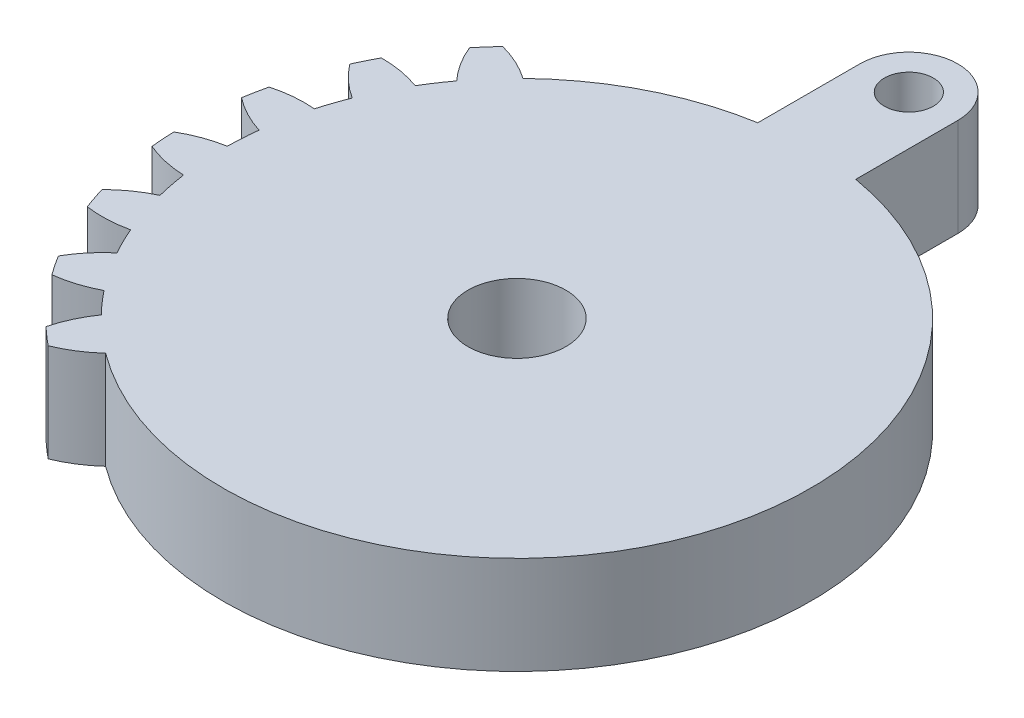
ISO-10303-21;
HEADER;
FILE_DESCRIPTION(('STEP AP214'),'2;1');
FILE_NAME('part.step','',(''),(''),'','','');
FILE_SCHEMA(('AUTOMOTIVE_DESIGN { 1 0 10303 214 1 1 1 1 }'));
ENDSEC;
DATA;
#1=APPLICATION_CONTEXT('core data for automotive mechanical design processes');
#2=APPLICATION_PROTOCOL_DEFINITION('international standard','automotive_design',2000,#1);
#3=PRODUCT_CONTEXT('',#1,'mechanical');
#4=PRODUCT('Part','Part','',(#3));
#5=PRODUCT_RELATED_PRODUCT_CATEGORY('part','',(#4));
#6=PRODUCT_DEFINITION_FORMATION('','',#4);
#7=PRODUCT_DEFINITION_CONTEXT('part definition',#1,'design');
#8=PRODUCT_DEFINITION('design','',#6,#7);
#9=PRODUCT_DEFINITION_SHAPE('','',#8);
#10=(LENGTH_UNIT() NAMED_UNIT(*) SI_UNIT(.MILLI.,.METRE.));
#11=(NAMED_UNIT(*) PLANE_ANGLE_UNIT() SI_UNIT($,.RADIAN.));
#12=(NAMED_UNIT(*) SI_UNIT($,.STERADIAN.) SOLID_ANGLE_UNIT());
#13=UNCERTAINTY_MEASURE_WITH_UNIT(LENGTH_MEASURE(1.E-05),#10,'distance_accuracy_value','');
#14=(GEOMETRIC_REPRESENTATION_CONTEXT(3) GLOBAL_UNCERTAINTY_ASSIGNED_CONTEXT((#13)) GLOBAL_UNIT_ASSIGNED_CONTEXT((#10,
#11,#12)) REPRESENTATION_CONTEXT('',''));
#15=CARTESIAN_POINT('',(0.,0.,0.));
#16=DIRECTION('',(0.,0.,1.));
#17=DIRECTION('',(1.,0.,0.));
#18=AXIS2_PLACEMENT_3D('',#15,#16,#17);
#19=CARTESIAN_POINT('',(0.,6.35,0.));
#20=DIRECTION('',(0.,-1.,0.));
#21=DIRECTION('',(0.,0.,-1.));
#22=AXIS2_PLACEMENT_3D('',#19,#20,#21);
#23=CYLINDRICAL_SURFACE('',#22,19.05);
#24=CARTESIAN_POINT('',(0.,6.35,0.));
#25=DIRECTION('',(0.,1.,0.));
#26=DIRECTION('',(0.,0.,1.));
#27=AXIS2_PLACEMENT_3D('',#24,#25,#26);
#28=CIRCLE('',#27,19.05);
#29=CARTESIAN_POINT('',(-3.175,6.35,-18.7835533113413));
#30=VERTEX_POINT('',#29);
#31=CARTESIAN_POINT('',(-13.2726773518231,6.35,-13.6652309133217));
#32=VERTEX_POINT('',#31);
#33=EDGE_CURVE('E55',#30,#32,#28,.T.);
#34=ORIENTED_EDGE('',*,*,#33,.F.);
#35=DIRECTION('',(0.,-1.,0.));
#36=VECTOR('',#35,1.);
#37=CARTESIAN_POINT('',(-3.175,6.35,-18.7835533113413));
#38=LINE('',#37,#36);
#39=CARTESIAN_POINT('',(-3.175,0.,-18.7835533113413));
#40=VERTEX_POINT('',#39);
#41=EDGE_CURVE('E273',#30,#40,#38,.T.);
#42=ORIENTED_EDGE('',*,*,#41,.T.);
#43=CARTESIAN_POINT('',(0.,0.,0.));
#44=DIRECTION('',(0.,1.,0.));
#45=DIRECTION('',(0.,0.,1.));
#46=AXIS2_PLACEMENT_3D('',#43,#44,#45);
#47=CIRCLE('',#46,19.05);
#48=CARTESIAN_POINT('',(-13.2726773518231,0.,-13.6652309133217));
#49=VERTEX_POINT('',#48);
#50=EDGE_CURVE('E606',#40,#49,#47,.T.);
#51=ORIENTED_EDGE('',*,*,#50,.T.);
#52=DIRECTION('',(0.,-1.,0.));
#53=VECTOR('',#52,1.);
#54=CARTESIAN_POINT('',(-13.2726773518231,11.211783242488,-13.6652309133217));
#55=LINE('',#54,#53);
#56=EDGE_CURVE('E324',#32,#49,#55,.T.);
#57=ORIENTED_EDGE('',*,*,#56,.F.);
#58=EDGE_LOOP('',(#34,#42,#51,#57));
#59=FACE_BOUND('',#58,.T.);
#60=ADVANCED_FACE('F44',(#59),#23,.T.);
#61=DIRECTION('',(0.,-1.,0.));
#62=VECTOR('',#61,1.);
#63=CARTESIAN_POINT('',(-15.2807550037981,11.211783242488,-11.375457200214));
#64=LINE('',#63,#62);
#65=CARTESIAN_POINT('',(-15.2807550037981,6.35,-11.375457200214));
#66=VERTEX_POINT('',#65);
#67=CARTESIAN_POINT('',(-15.2807550037981,0.,-11.375457200214));
#68=VERTEX_POINT('',#67);
#69=EDGE_CURVE('E332',#66,#68,#64,.T.);
#70=ORIENTED_EDGE('',*,*,#69,.T.);
#71=CARTESIAN_POINT('',(-16.3572438542193,0.,-9.76437778322842));
#72=VERTEX_POINT('',#71);
#73=EDGE_CURVE('E638',#68,#72,#47,.T.);
#74=ORIENTED_EDGE('',*,*,#73,.T.);
#75=DIRECTION('',(0.,-1.,0.));
#76=VECTOR('',#75,1.);
#77=CARTESIAN_POINT('',(-16.3572438542193,10.964723471058,-9.76437778322842));
#78=LINE('',#77,#76);
#79=CARTESIAN_POINT('',(-16.3572438542193,6.35,-9.76437778322842));
#80=VERTEX_POINT('',#79);
#81=EDGE_CURVE('E361',#80,#72,#78,.T.);
#82=ORIENTED_EDGE('',*,*,#81,.F.);
#83=EDGE_CURVE('E653',#66,#80,#28,.T.);
#84=ORIENTED_EDGE('',*,*,#83,.F.);
#85=EDGE_LOOP('',(#70,#74,#82,#84));
#86=FACE_BOUND('',#85,.T.);
#87=ADVANCED_FACE('F590',(#86),#23,.T.);
#88=DIRECTION('',(0.,-1.,0.));
#89=VECTOR('',#88,1.);
#90=CARTESIAN_POINT('',(-17.7042608735284,10.964723471058,-7.03289747700406));
#91=LINE('',#90,#89);
#92=CARTESIAN_POINT('',(-17.7042608735284,6.35,-7.03289747700406));
#93=VERTEX_POINT('',#92);
#94=CARTESIAN_POINT('',(-17.7042608735284,0.,-7.03289747700406));
#95=VERTEX_POINT('',#94);
#96=EDGE_CURVE('E369',#93,#95,#91,.T.);
#97=ORIENTED_EDGE('',*,*,#96,.T.);
#98=CARTESIAN_POINT('',(-18.327091219574,0.,-5.19809844360539));
#99=VERTEX_POINT('',#98);
#100=EDGE_CURVE('E565',#95,#99,#47,.T.);
#101=ORIENTED_EDGE('',*,*,#100,.T.);
#102=DIRECTION('',(0.,-1.,0.));
#103=VECTOR('',#102,1.);
#104=CARTESIAN_POINT('',(-18.327091219574,10.5928529083665,-5.1980984436054));
#105=LINE('',#104,#103);
#106=CARTESIAN_POINT('',(-18.327091219574,6.35,-5.19809844360539));
#107=VERTEX_POINT('',#106);
#108=EDGE_CURVE('E545',#107,#99,#105,.T.);
#109=ORIENTED_EDGE('',*,*,#108,.F.);
#110=EDGE_CURVE('E604',#93,#107,#28,.T.);
#111=ORIENTED_EDGE('',*,*,#110,.F.);
#112=EDGE_LOOP('',(#97,#101,#109,#111));
#113=FACE_BOUND('',#112,.T.);
#114=ADVANCED_FACE('F594',(#113),#23,.T.);
#115=CARTESIAN_POINT('',(-11.375457200214,0.,15.2807550037981));
#116=VERTEX_POINT('',#115);
#117=CARTESIAN_POINT('',(3.175,0.,-18.7835533113413));
#118=VERTEX_POINT('',#117);
#119=EDGE_CURVE('E639',#116,#118,#47,.T.);
#120=ORIENTED_EDGE('',*,*,#119,.T.);
#121=DIRECTION('',(0.,-1.,0.));
#122=VECTOR('',#121,1.);
#123=CARTESIAN_POINT('',(3.175,6.35,-18.7835533113413));
#124=LINE('',#123,#122);
#125=CARTESIAN_POINT('',(3.175,6.35,-18.7835533113413));
#126=VERTEX_POINT('',#125);
#127=EDGE_CURVE('E69',#118,#126,#124,.F.);
#128=ORIENTED_EDGE('',*,*,#127,.T.);
#129=CARTESIAN_POINT('',(-11.375457200214,6.35,15.2807550037981));
#130=VERTEX_POINT('',#129);
#131=EDGE_CURVE('E685',#130,#126,#28,.T.);
#132=ORIENTED_EDGE('',*,*,#131,.F.);
#133=DIRECTION('',(0.,-1.,0.));
#134=VECTOR('',#133,1.);
#135=CARTESIAN_POINT('',(-11.375457200214,11.211783242488,15.2807550037981));
#136=LINE('',#135,#134);
#137=EDGE_CURVE('E406',#130,#116,#136,.T.);
#138=ORIENTED_EDGE('',*,*,#137,.T.);
#139=EDGE_LOOP('',(#120,#128,#132,#138));
#140=FACE_BOUND('',#139,.T.);
#141=ADVANCED_FACE('F997',(#140),#23,.T.);
#142=CARTESIAN_POINT('',(-14.9427983140612,0.,11.8158909332005));
#143=VERTEX_POINT('',#142);
#144=CARTESIAN_POINT('',(-13.6652309133216,0.,13.2726773518232));
#145=VERTEX_POINT('',#144);
#146=EDGE_CURVE('E659',#143,#145,#47,.T.);
#147=ORIENTED_EDGE('',*,*,#146,.T.);
#148=DIRECTION('',(0.,-1.,0.));
#149=VECTOR('',#148,1.);
#150=CARTESIAN_POINT('',(-13.6652309133216,11.211783242488,13.2726773518232));
#151=LINE('',#150,#149);
#152=CARTESIAN_POINT('',(-13.6652309133216,6.35,13.2726773518232));
#153=VERTEX_POINT('',#152);
#154=EDGE_CURVE('E398',#153,#145,#151,.T.);
#155=ORIENTED_EDGE('',*,*,#154,.F.);
#156=CARTESIAN_POINT('',(-14.9427983140612,6.35,11.8158909332005));
#157=VERTEX_POINT('',#156);
#158=EDGE_CURVE('E682',#157,#153,#28,.T.);
#159=ORIENTED_EDGE('',*,*,#158,.F.);
#160=DIRECTION('',(0.,-1.,0.));
#161=VECTOR('',#160,1.);
#162=CARTESIAN_POINT('',(-14.9427983140612,11.1289223719387,11.8158909332005));
#163=LINE('',#162,#161);
#164=EDGE_CURVE('E443',#157,#143,#163,.T.);
#165=ORIENTED_EDGE('',*,*,#164,.T.);
#166=EDGE_LOOP('',(#147,#155,#159,#165));
#167=FACE_BOUND('',#166,.T.);
#168=ADVANCED_FACE('F1006',(#167),#23,.T.);
#169=CARTESIAN_POINT('',(-17.4918124169469,0.,7.54579342218832));
#170=VERTEX_POINT('',#169);
#171=CARTESIAN_POINT('',(-16.6348211395338,0.,9.28359982203663));
#172=VERTEX_POINT('',#171);
#173=EDGE_CURVE('E661',#170,#172,#47,.T.);
#174=ORIENTED_EDGE('',*,*,#173,.T.);
#175=DIRECTION('',(0.,-1.,0.));
#176=VECTOR('',#175,1.);
#177=CARTESIAN_POINT('',(-16.6348211395338,11.1289223719387,9.28359982203664));
#178=LINE('',#177,#176);
#179=CARTESIAN_POINT('',(-16.6348211395338,6.35,9.28359982203663));
#180=VERTEX_POINT('',#179);
#181=EDGE_CURVE('E435',#180,#172,#178,.T.);
#182=ORIENTED_EDGE('',*,*,#181,.F.);
#183=CARTESIAN_POINT('',(-17.4918124169469,6.35,7.54579342218833));
#184=VERTEX_POINT('',#183);
#185=EDGE_CURVE('E680',#184,#180,#28,.T.);
#186=ORIENTED_EDGE('',*,*,#185,.F.);
#187=DIRECTION('',(0.,-1.,0.));
#188=VECTOR('',#187,1.);
#189=CARTESIAN_POINT('',(-17.4918124169469,10.7707527895386,7.54579342218832));
#190=LINE('',#189,#188);
#191=EDGE_CURVE('E480',#184,#170,#190,.T.);
#192=ORIENTED_EDGE('',*,*,#191,.T.);
#193=EDGE_LOOP('',(#174,#182,#186,#192));
#194=FACE_BOUND('',#193,.T.);
#195=ADVANCED_FACE('F587',(#194),#23,.T.);
#196=CARTESIAN_POINT('',(-18.8487884102045,0.,2.76146255946726));
#197=VERTEX_POINT('',#196);
#198=CARTESIAN_POINT('',(-18.4707757954285,0.,4.6618603062524));
#199=VERTEX_POINT('',#198);
#200=EDGE_CURVE('E605',#197,#199,#47,.T.);
#201=ORIENTED_EDGE('',*,*,#200,.T.);
#202=DIRECTION('',(0.,-1.,0.));
#203=VECTOR('',#202,1.);
#204=CARTESIAN_POINT('',(-18.4707757954285,10.7707527895386,4.6618603062524));
#205=LINE('',#204,#203);
#206=CARTESIAN_POINT('',(-18.4707757954285,6.35,4.6618603062524));
#207=VERTEX_POINT('',#206);
#208=EDGE_CURVE('E472',#207,#199,#205,.T.);
#209=ORIENTED_EDGE('',*,*,#208,.F.);
#210=CARTESIAN_POINT('',(-18.8487884102045,6.35,2.76146255946724));
#211=VERTEX_POINT('',#210);
#212=EDGE_CURVE('E54',#211,#207,#28,.T.);
#213=ORIENTED_EDGE('',*,*,#212,.F.);
#214=DIRECTION('',(0.,-1.,0.));
#215=VECTOR('',#214,1.);
#216=CARTESIAN_POINT('',(-18.8487884102045,10.4361096651987,2.76146255946724));
#217=LINE('',#216,#215);
#218=EDGE_CURVE('E517',#211,#197,#217,.T.);
#219=ORIENTED_EDGE('',*,*,#218,.T.);
#220=EDGE_LOOP('',(#201,#209,#213,#219));
#221=FACE_BOUND('',#220,.T.);
#222=ADVANCED_FACE('F581',(#221),#23,.T.);
#223=CARTESIAN_POINT('',(0.,6.35,0.));
#224=DIRECTION('',(0.,1.,0.));
#225=DIRECTION('',(0.,0.,1.));
#226=AXIS2_PLACEMENT_3D('',#223,#224,#225);
#227=PLANE('',#226);
#228=CARTESIAN_POINT('',(0.,6.35,0.));
#229=DIRECTION('',(0.,1.,0.));
#230=DIRECTION('',(0.,0.,1.));
#231=AXIS2_PLACEMENT_3D('',#228,#229,#230);
#232=CIRCLE('',#231,3.175);
#233=CARTESIAN_POINT('',(0.,6.35,3.175));
#234=VERTEX_POINT('',#233);
#235=EDGE_CURVE('E561',#234,#234,#232,.T.);
#236=ORIENTED_EDGE('',*,*,#235,.F.);
#237=EDGE_LOOP('',(#236));
#238=FACE_BOUND('',#237,.T.);
#239=ORIENTED_EDGE('',*,*,#131,.T.);
#240=DIRECTION('',(0.,0.,-1.));
#241=VECTOR('',#240,1.);
#242=CARTESIAN_POINT('',(3.175,6.35,-25.3999999016287));
#243=LINE('',#242,#241);
#244=CARTESIAN_POINT('',(3.175,6.35,-25.3999999016287));
#245=VERTEX_POINT('',#244);
#246=EDGE_CURVE('E268',#126,#245,#243,.T.);
#247=ORIENTED_EDGE('',*,*,#246,.T.);
#248=CARTESIAN_POINT('',(0.,6.35,-25.4));
#249=DIRECTION('',(0.,1.,0.));
#250=DIRECTION('',(0.,0.,1.));
#251=AXIS2_PLACEMENT_3D('',#248,#249,#250);
#252=CIRCLE('',#251,3.175);
#253=CARTESIAN_POINT('',(-3.175,6.35,-25.3999999016287));
#254=VERTEX_POINT('',#253);
#255=EDGE_CURVE('E262',#245,#254,#252,.T.);
#256=ORIENTED_EDGE('',*,*,#255,.T.);
#257=DIRECTION('',(0.,0.,1.));
#258=VECTOR('',#257,1.);
#259=CARTESIAN_POINT('',(-3.175,6.35,-25.3999999016287));
#260=LINE('',#259,#258);
#261=EDGE_CURVE('E271',#254,#30,#260,.T.);
#262=ORIENTED_EDGE('',*,*,#261,.T.);
#263=ORIENTED_EDGE('',*,*,#33,.T.);
#264=CARTESIAN_POINT('',(-17.649504588583,6.35,-7.42762052635798));
#265=DIRECTION('',(0.,1.,0.));
#266=DIRECTION('',(0.,0.,1.));
#267=AXIS2_PLACEMENT_3D('',#264,#265,#266);
#268=CIRCLE('',#267,7.62);
#269=CARTESIAN_POINT('',(-15.7197681360626,6.35,-14.7992226062192));
#270=VERTEX_POINT('',#269);
#271=EDGE_CURVE('E308',#270,#32,#268,.F.);
#272=ORIENTED_EDGE('',*,*,#271,.F.);
#273=CARTESIAN_POINT('',(0.,6.35,0.));
#274=DIRECTION('',(0.,1.,0.));
#275=DIRECTION('',(0.,0.,1.));
#276=AXIS2_PLACEMENT_3D('',#273,#274,#275);
#277=CIRCLE('',#276,21.59);
#278=CARTESIAN_POINT('',(-16.7244546826455,6.35,-13.6535971658804));
#279=VERTEX_POINT('',#278);
#280=EDGE_CURVE('E303',#270,#279,#277,.T.);
#281=ORIENTED_EDGE('',*,*,#280,.T.);
#282=CARTESIAN_POINT('',(-9.66779883161027,6.35,-16.5290116055831));
#283=DIRECTION('',(0.,1.,0.));
#284=DIRECTION('',(0.,0.,1.));
#285=AXIS2_PLACEMENT_3D('',#282,#283,#284);
#286=CIRCLE('',#285,7.62);
#287=EDGE_CURVE('E309',#279,#66,#286,.T.);
#288=ORIENTED_EDGE('',*,*,#287,.T.);
#289=ORIENTED_EDGE('',*,*,#83,.T.);
#290=CARTESIAN_POINT('',(-18.9705219553356,6.35,-2.60650257013437));
#291=DIRECTION('',(0.,1.,0.));
#292=DIRECTION('',(0.,0.,1.));
#293=AXIS2_PLACEMENT_3D('',#290,#291,#292);
#294=CIRCLE('',#293,7.62);
#295=CARTESIAN_POINT('',(-19.0144506891002,6.35,-10.2263759461394));
#296=VERTEX_POINT('',#295);
#297=EDGE_CURVE('E345',#296,#80,#294,.F.);
#298=ORIENTED_EDGE('',*,*,#297,.F.);
#299=CARTESIAN_POINT('',(0.,6.35,0.));
#300=DIRECTION('',(0.,1.,0.));
#301=DIRECTION('',(0.,0.,1.));
#302=AXIS2_PLACEMENT_3D('',#299,#300,#301);
#303=CIRCLE('',#302,21.59);
#304=CARTESIAN_POINT('',(-19.6883936892561,6.35,-8.85975473344842));
#305=VERTEX_POINT('',#304);
#306=EDGE_CURVE('E320',#296,#305,#303,.T.);
#307=ORIENTED_EDGE('',*,*,#306,.T.);
#308=CARTESIAN_POINT('',(-13.6163995750651,6.35,-13.4635887310238));
#309=DIRECTION('',(0.,1.,0.));
#310=DIRECTION('',(0.,0.,1.));
#311=AXIS2_PLACEMENT_3D('',#308,#309,#310);
#312=CIRCLE('',#311,7.62);
#313=EDGE_CURVE('E346',#305,#93,#312,.T.);
#314=ORIENTED_EDGE('',*,*,#313,.T.);
#315=ORIENTED_EDGE('',*,*,#110,.T.);
#316=CARTESIAN_POINT('',(-18.9987296011018,6.35,2.39224422879474));
#317=DIRECTION('',(0.,1.,0.));
#318=DIRECTION('',(0.,0.,1.));
#319=AXIS2_PLACEMENT_3D('',#316,#317,#318);
#320=CIRCLE('',#319,7.62);
#321=CARTESIAN_POINT('',(-21.013329850541,6.35,-4.95661866521543));
#322=VERTEX_POINT('',#321);
#323=EDGE_CURVE('E529',#322,#107,#320,.F.);
#324=ORIENTED_EDGE('',*,*,#323,.F.);
#325=CARTESIAN_POINT('',(0.,6.35,0.));
#326=DIRECTION('',(0.,1.,0.));
#327=DIRECTION('',(0.,0.,1.));
#328=AXIS2_PLACEMENT_3D('',#325,#326,#327);
#329=CIRCLE('',#328,21.59);
#330=CARTESIAN_POINT('',(-21.3106012025528,6.35,-3.46213465736889));
#331=VERTEX_POINT('',#330);
#332=EDGE_CURVE('E505',#322,#331,#329,.T.);
#333=ORIENTED_EDGE('',*,*,#332,.T.);
#334=CARTESIAN_POINT('',(-16.6370651896436,6.35,-9.48064453407761));
#335=DIRECTION('',(0.,1.,0.));
#336=DIRECTION('',(0.,0.,1.));
#337=AXIS2_PLACEMENT_3D('',#334,#335,#336);
#338=CIRCLE('',#337,7.62);
#339=CARTESIAN_POINT('',(-18.9212506224023,6.35,-2.21105741314889));
#340=VERTEX_POINT('',#339);
#341=EDGE_CURVE('E530',#331,#340,#338,.T.);
#342=ORIENTED_EDGE('',*,*,#341,.T.);
#343=CARTESIAN_POINT('',(-19.047977605265,6.35,-0.277577285314525));
#344=VERTEX_POINT('',#343);
#345=EDGE_CURVE('E11',#340,#344,#28,.T.);
#346=ORIENTED_EDGE('',*,*,#345,.T.);
#347=CARTESIAN_POINT('',(-17.7322052214382,6.35,7.227963536902));
#348=DIRECTION('',(0.,1.,0.));
#349=DIRECTION('',(0.,0.,1.));
#350=AXIS2_PLACEMENT_3D('',#347,#348,#349);
#351=CIRCLE('',#350,7.62);
#352=CARTESIAN_POINT('',(-21.580185308837,6.35,0.650923986543298));
#353=VERTEX_POINT('',#352);
#354=EDGE_CURVE('E493',#353,#344,#351,.F.);
#355=ORIENTED_EDGE('',*,*,#354,.F.);
#356=CARTESIAN_POINT('',(0.,6.35,0.));
#357=DIRECTION('',(0.,1.,0.));
#358=DIRECTION('',(0.,0.,1.));
#359=AXIS2_PLACEMENT_3D('',#356,#357,#358);
#360=CIRCLE('',#359,21.59);
#361=CARTESIAN_POINT('',(-21.4805264613292,6.35,2.17142417416229));
#362=VERTEX_POINT('',#361);
#363=EDGE_CURVE('E468',#353,#362,#360,.T.);
#364=ORIENTED_EDGE('',*,*,#363,.T.);
#365=CARTESIAN_POINT('',(-18.523942305598,6.35,-4.85161007963991));
#366=DIRECTION('',(0.,1.,0.));
#367=DIRECTION('',(0.,0.,1.));
#368=AXIS2_PLACEMENT_3D('',#365,#366,#367);
#369=CIRCLE('',#368,7.62);
#370=EDGE_CURVE('E494',#362,#211,#369,.T.);
#371=ORIENTED_EDGE('',*,*,#370,.T.);
#372=ORIENTED_EDGE('',*,*,#212,.T.);
#373=CARTESIAN_POINT('',(-15.2572603597882,6.35,11.5711090747439));
#374=DIRECTION('',(0.,1.,0.));
#375=DIRECTION('',(0.,0.,1.));
#376=AXIS2_PLACEMENT_3D('',#373,#374,#375);
#377=CIRCLE('',#376,7.62);
#378=CARTESIAN_POINT('',(-20.6763868012781,6.35,6.21410724432185));
#379=VERTEX_POINT('',#378);
#380=EDGE_CURVE('E456',#379,#207,#377,.F.);
#381=ORIENTED_EDGE('',*,*,#380,.F.);
#382=CARTESIAN_POINT('',(0.,6.35,0.));
#383=DIRECTION('',(0.,1.,0.));
#384=DIRECTION('',(0.,0.,1.));
#385=AXIS2_PLACEMENT_3D('',#382,#383,#384);
#386=CIRCLE('',#385,21.59);
#387=CARTESIAN_POINT('',(-20.1865893400144,6.35,7.65700403667243));
#388=VERTEX_POINT('',#387);
#389=EDGE_CURVE('E431',#379,#388,#386,.T.);
#390=ORIENTED_EDGE('',*,*,#389,.T.);
#391=CARTESIAN_POINT('',(-19.1484433656879,6.35,0.108053584060514));
#392=DIRECTION('',(0.,1.,0.));
#393=DIRECTION('',(0.,0.,1.));
#394=AXIS2_PLACEMENT_3D('',#391,#392,#393);
#395=CIRCLE('',#394,7.62);
#396=EDGE_CURVE('E457',#388,#184,#395,.T.);
#397=ORIENTED_EDGE('',*,*,#396,.T.);
#398=ORIENTED_EDGE('',*,*,#185,.T.);
#399=CARTESIAN_POINT('',(-11.7425584184335,6.35,15.1257026513039));
#400=DIRECTION('',(0.,1.,0.));
#401=DIRECTION('',(0.,0.,1.));
#402=AXIS2_PLACEMENT_3D('',#399,#400,#401);
#403=CIRCLE('',#402,7.62);
#404=CARTESIAN_POINT('',(-18.3635267025569,6.35,11.3538093626976));
#405=VERTEX_POINT('',#404);
#406=EDGE_CURVE('E419',#405,#180,#403,.F.);
#407=ORIENTED_EDGE('',*,*,#406,.F.);
#408=CARTESIAN_POINT('',(0.,6.35,0.));
#409=DIRECTION('',(0.,1.,0.));
#410=DIRECTION('',(0.,0.,1.));
#411=AXIS2_PLACEMENT_3D('',#408,#409,#410);
#412=CIRCLE('',#411,21.59);
#413=CARTESIAN_POINT('',(-17.5169695150938,6.35,12.6207717278808));
#414=VERTEX_POINT('',#413);
#415=EDGE_CURVE('E394',#405,#414,#412,.T.);
#416=ORIENTED_EDGE('',*,*,#415,.T.);
#417=CARTESIAN_POINT('',(-18.4680096547051,6.35,5.0603535745742));
#418=DIRECTION('',(0.,1.,0.));
#419=DIRECTION('',(0.,0.,1.));
#420=AXIS2_PLACEMENT_3D('',#417,#418,#419);
#421=CIRCLE('',#420,7.62);
#422=EDGE_CURVE('E420',#414,#157,#421,.T.);
#423=ORIENTED_EDGE('',*,*,#422,.T.);
#424=ORIENTED_EDGE('',*,*,#158,.T.);
#425=CARTESIAN_POINT('',(-7.42762052635792,6.35,17.649504588583));
#426=DIRECTION('',(0.,1.,0.));
#427=DIRECTION('',(0.,0.,1.));
#428=AXIS2_PLACEMENT_3D('',#425,#426,#427);
#429=CIRCLE('',#428,7.62);
#430=CARTESIAN_POINT('',(-14.7992226062191,6.35,15.7197681360627));
#431=VERTEX_POINT('',#430);
#432=EDGE_CURVE('E382',#431,#153,#429,.F.);
#433=ORIENTED_EDGE('',*,*,#432,.F.);
#434=CARTESIAN_POINT('',(0.,6.35,0.));
#435=DIRECTION('',(0.,1.,0.));
#436=DIRECTION('',(0.,0.,1.));
#437=AXIS2_PLACEMENT_3D('',#434,#435,#436);
#438=CIRCLE('',#437,21.59);
#439=CARTESIAN_POINT('',(-13.6535971658804,6.35,16.7244546826455));
#440=VERTEX_POINT('',#439);
#441=EDGE_CURVE('E357',#431,#440,#438,.T.);
#442=ORIENTED_EDGE('',*,*,#441,.T.);
#443=CARTESIAN_POINT('',(-16.5290116055831,6.35,9.66779883161033));
#444=DIRECTION('',(0.,1.,0.));
#445=DIRECTION('',(0.,0.,1.));
#446=AXIS2_PLACEMENT_3D('',#443,#444,#445);
#447=CIRCLE('',#446,7.62);
#448=EDGE_CURVE('E383',#440,#130,#447,.T.);
#449=ORIENTED_EDGE('',*,*,#448,.T.);
#450=EDGE_LOOP('',(#239,#247,#256,#262,#263,#272,#281,#288,#289,#298,#307,#314,#315,#324,#333,
#342,#346,#355,#364,#371,#372,#381,#390,#397,#398,#407,#416,#423,#424,#433,#442,#449));
#451=FACE_BOUND('',#450,.T.);
#452=CARTESIAN_POINT('',(0.,6.35,-25.4));
#453=DIRECTION('',(0.,1.,0.));
#454=DIRECTION('',(0.,0.,1.));
#455=AXIS2_PLACEMENT_3D('',#452,#453,#454);
#456=CIRCLE('',#455,1.5875);
#457=CARTESIAN_POINT('',(0.,6.35,-23.8125));
#458=VERTEX_POINT('',#457);
#459=EDGE_CURVE('E282',#458,#458,#456,.T.);
#460=ORIENTED_EDGE('',*,*,#459,.F.);
#461=EDGE_LOOP('',(#460));
#462=FACE_BOUND('',#461,.T.);
#463=ADVANCED_FACE('F277',(#238,#451,#462),#227,.T.);
#464=CARTESIAN_POINT('',(0.,0.,0.));
#465=DIRECTION('',(0.,1.,0.));
#466=DIRECTION('',(0.,0.,1.));
#467=AXIS2_PLACEMENT_3D('',#464,#465,#466);
#468=PLANE('',#467);
#469=CARTESIAN_POINT('',(0.,0.,0.));
#470=DIRECTION('',(0.,1.,0.));
#471=DIRECTION('',(0.,0.,1.));
#472=AXIS2_PLACEMENT_3D('',#469,#470,#471);
#473=CIRCLE('',#472,3.175);
#474=CARTESIAN_POINT('',(0.,0.,3.175));
#475=VERTEX_POINT('',#474);
#476=EDGE_CURVE('E541',#475,#475,#473,.T.);
#477=ORIENTED_EDGE('',*,*,#476,.T.);
#478=EDGE_LOOP('',(#477));
#479=FACE_BOUND('',#478,.T.);
#480=ORIENTED_EDGE('',*,*,#50,.F.);
#481=DIRECTION('',(0.,0.,-1.));
#482=VECTOR('',#481,1.);
#483=CARTESIAN_POINT('',(-3.175,0.,-25.3999999016287));
#484=LINE('',#483,#482);
#485=CARTESIAN_POINT('',(-3.175,0.,-25.3999999016287));
#486=VERTEX_POINT('',#485);
#487=EDGE_CURVE('E298',#40,#486,#484,.T.);
#488=ORIENTED_EDGE('',*,*,#487,.T.);
#489=CARTESIAN_POINT('',(0.,0.,-25.4));
#490=DIRECTION('',(0.,1.,0.));
#491=DIRECTION('',(0.,0.,1.));
#492=AXIS2_PLACEMENT_3D('',#489,#490,#491);
#493=CIRCLE('',#492,3.175);
#494=CARTESIAN_POINT('',(3.175,0.,-25.3999999016287));
#495=VERTEX_POINT('',#494);
#496=EDGE_CURVE('E263',#486,#495,#493,.F.);
#497=ORIENTED_EDGE('',*,*,#496,.T.);
#498=DIRECTION('',(0.,0.,1.));
#499=VECTOR('',#498,1.);
#500=CARTESIAN_POINT('',(3.175,0.,-25.3999999016287));
#501=LINE('',#500,#499);
#502=EDGE_CURVE('E292',#495,#118,#501,.T.);
#503=ORIENTED_EDGE('',*,*,#502,.T.);
#504=ORIENTED_EDGE('',*,*,#119,.F.);
#505=CARTESIAN_POINT('',(-16.5290116055831,0.,9.66779883161033));
#506=DIRECTION('',(0.,1.,0.));
#507=DIRECTION('',(0.86602540378444,0.,0.499999999999998));
#508=AXIS2_PLACEMENT_3D('',#505,#506,#507);
#509=CIRCLE('',#508,7.62);
#510=CARTESIAN_POINT('',(-13.6535971658804,0.,16.7244546826455));
#511=VERTEX_POINT('',#510);
#512=EDGE_CURVE('E384',#511,#116,#509,.T.);
#513=ORIENTED_EDGE('',*,*,#512,.F.);
#514=CARTESIAN_POINT('',(0.,0.,0.));
#515=DIRECTION('',(0.,1.,0.));
#516=DIRECTION('',(0.86602540378444,0.,0.499999999999998));
#517=AXIS2_PLACEMENT_3D('',#514,#515,#516);
#518=CIRCLE('',#517,21.59);
#519=CARTESIAN_POINT('',(-14.7992226062192,0.,15.7197681360627));
#520=VERTEX_POINT('',#519);
#521=EDGE_CURVE('E390',#520,#511,#518,.T.);
#522=ORIENTED_EDGE('',*,*,#521,.F.);
#523=CARTESIAN_POINT('',(-7.42762052635792,0.,17.649504588583));
#524=DIRECTION('',(0.,1.,0.));
#525=DIRECTION('',(0.86602540378444,0.,0.499999999999998));
#526=AXIS2_PLACEMENT_3D('',#523,#524,#525);
#527=CIRCLE('',#526,7.62);
#528=EDGE_CURVE('E378',#520,#145,#527,.F.);
#529=ORIENTED_EDGE('',*,*,#528,.T.);
#530=ORIENTED_EDGE('',*,*,#146,.F.);
#531=CARTESIAN_POINT('',(-18.4680096547051,0.,5.0603535745742));
#532=DIRECTION('',(0.,1.,0.));
#533=DIRECTION('',(0.707106781186549,0.,0.707106781186546));
#534=AXIS2_PLACEMENT_3D('',#531,#532,#533);
#535=CIRCLE('',#534,7.62);
#536=CARTESIAN_POINT('',(-17.5169695150938,0.,12.6207717278808));
#537=VERTEX_POINT('',#536);
#538=EDGE_CURVE('E421',#537,#143,#535,.T.);
#539=ORIENTED_EDGE('',*,*,#538,.F.);
#540=CARTESIAN_POINT('',(0.,0.,0.));
#541=DIRECTION('',(0.,1.,0.));
#542=DIRECTION('',(0.707106781186549,0.,0.707106781186546));
#543=AXIS2_PLACEMENT_3D('',#540,#541,#542);
#544=CIRCLE('',#543,21.59);
#545=CARTESIAN_POINT('',(-18.3635267025569,0.,11.3538093626976));
#546=VERTEX_POINT('',#545);
#547=EDGE_CURVE('E427',#546,#537,#544,.T.);
#548=ORIENTED_EDGE('',*,*,#547,.F.);
#549=CARTESIAN_POINT('',(-11.7425584184335,0.,15.1257026513039));
#550=DIRECTION('',(0.,1.,0.));
#551=DIRECTION('',(0.707106781186549,0.,0.707106781186546));
#552=AXIS2_PLACEMENT_3D('',#549,#550,#551);
#553=CIRCLE('',#552,7.62);
#554=EDGE_CURVE('E415',#546,#172,#553,.F.);
#555=ORIENTED_EDGE('',*,*,#554,.T.);
#556=ORIENTED_EDGE('',*,*,#173,.F.);
#557=CARTESIAN_POINT('',(-19.1484433656879,0.,0.108053584060514));
#558=DIRECTION('',(0.,1.,0.));
#559=DIRECTION('',(0.500000000000001,0.,0.866025403784438));
#560=AXIS2_PLACEMENT_3D('',#557,#558,#559);
#561=CIRCLE('',#560,7.62);
#562=CARTESIAN_POINT('',(-20.1865893400144,0.,7.65700403667244));
#563=VERTEX_POINT('',#562);
#564=EDGE_CURVE('E458',#563,#170,#561,.T.);
#565=ORIENTED_EDGE('',*,*,#564,.F.);
#566=CARTESIAN_POINT('',(0.,0.,0.));
#567=DIRECTION('',(0.,1.,0.));
#568=DIRECTION('',(0.500000000000001,0.,0.866025403784438));
#569=AXIS2_PLACEMENT_3D('',#566,#567,#568);
#570=CIRCLE('',#569,21.59);
#571=CARTESIAN_POINT('',(-20.6763868012781,0.,6.21410724432184));
#572=VERTEX_POINT('',#571);
#573=EDGE_CURVE('E464',#572,#563,#570,.T.);
#574=ORIENTED_EDGE('',*,*,#573,.F.);
#575=CARTESIAN_POINT('',(-15.2572603597882,0.,11.5711090747439));
#576=DIRECTION('',(0.,1.,0.));
#577=DIRECTION('',(0.500000000000001,0.,0.866025403784438));
#578=AXIS2_PLACEMENT_3D('',#575,#576,#577);
#579=CIRCLE('',#578,7.62);
#580=EDGE_CURVE('E452',#572,#199,#579,.F.);
#581=ORIENTED_EDGE('',*,*,#580,.T.);
#582=ORIENTED_EDGE('',*,*,#200,.F.);
#583=CARTESIAN_POINT('',(-18.523942305598,0.,-4.85161007963991));
#584=DIRECTION('',(0.,1.,0.));
#585=DIRECTION('',(0.258819045102521,0.,0.965925826289068));
#586=AXIS2_PLACEMENT_3D('',#583,#584,#585);
#587=CIRCLE('',#586,7.62);
#588=CARTESIAN_POINT('',(-21.4805264613292,0.,2.1714241741623));
#589=VERTEX_POINT('',#588);
#590=EDGE_CURVE('E495',#589,#197,#587,.T.);
#591=ORIENTED_EDGE('',*,*,#590,.F.);
#592=CARTESIAN_POINT('',(0.,0.,0.));
#593=DIRECTION('',(0.,1.,0.));
#594=DIRECTION('',(0.258819045102521,0.,0.965925826289068));
#595=AXIS2_PLACEMENT_3D('',#592,#593,#594);
#596=CIRCLE('',#595,21.59);
#597=CARTESIAN_POINT('',(-21.580185308837,0.,0.650923986543292));
#598=VERTEX_POINT('',#597);
#599=EDGE_CURVE('E501',#598,#589,#596,.T.);
#600=ORIENTED_EDGE('',*,*,#599,.F.);
#601=CARTESIAN_POINT('',(-17.7322052214382,0.,7.227963536902));
#602=DIRECTION('',(0.,1.,0.));
#603=DIRECTION('',(0.258819045102521,0.,0.965925826289068));
#604=AXIS2_PLACEMENT_3D('',#601,#602,#603);
#605=CIRCLE('',#604,7.62);
#606=CARTESIAN_POINT('',(-19.047977605265,0.,-0.277577285314525));
#607=VERTEX_POINT('',#606);
#608=EDGE_CURVE('E489',#598,#607,#605,.F.);
#609=ORIENTED_EDGE('',*,*,#608,.T.);
#610=CARTESIAN_POINT('',(-18.9212506224023,0.,-2.21105741314889));
#611=VERTEX_POINT('',#610);
#612=EDGE_CURVE('E48',#611,#607,#47,.T.);
#613=ORIENTED_EDGE('',*,*,#612,.F.);
#614=CARTESIAN_POINT('',(-16.6370651896436,0.,-9.48064453407761));
#615=DIRECTION('',(0.,1.,0.));
#616=DIRECTION('',(0.,0.,1.));
#617=AXIS2_PLACEMENT_3D('',#614,#615,#616);
#618=CIRCLE('',#617,7.62);
#619=CARTESIAN_POINT('',(-21.3106012025528,0.,-3.46213465736889));
#620=VERTEX_POINT('',#619);
#621=EDGE_CURVE('E531',#620,#611,#618,.T.);
#622=ORIENTED_EDGE('',*,*,#621,.F.);
#623=CARTESIAN_POINT('',(0.,0.,0.));
#624=DIRECTION('',(0.,1.,0.));
#625=DIRECTION('',(0.,0.,1.));
#626=AXIS2_PLACEMENT_3D('',#623,#624,#625);
#627=CIRCLE('',#626,21.59);
#628=CARTESIAN_POINT('',(-21.013329850541,0.,-4.95661866521544));
#629=VERTEX_POINT('',#628);
#630=EDGE_CURVE('E537',#629,#620,#627,.T.);
#631=ORIENTED_EDGE('',*,*,#630,.F.);
#632=CARTESIAN_POINT('',(-18.9987296011018,0.,2.39224422879474));
#633=DIRECTION('',(0.,1.,0.));
#634=DIRECTION('',(0.,0.,1.));
#635=AXIS2_PLACEMENT_3D('',#632,#633,#634);
#636=CIRCLE('',#635,7.62);
#637=EDGE_CURVE('E525',#629,#99,#636,.F.);
#638=ORIENTED_EDGE('',*,*,#637,.T.);
#639=ORIENTED_EDGE('',*,*,#100,.F.);
#640=CARTESIAN_POINT('',(-13.6163995750651,0.,-13.4635887310238));
#641=DIRECTION('',(0.,1.,0.));
#642=DIRECTION('',(-0.258819045102521,0.,0.965925826289068));
#643=AXIS2_PLACEMENT_3D('',#640,#641,#642);
#644=CIRCLE('',#643,7.62);
#645=CARTESIAN_POINT('',(-19.6883936892561,0.,-8.85975473344842));
#646=VERTEX_POINT('',#645);
#647=EDGE_CURVE('E347',#646,#95,#644,.T.);
#648=ORIENTED_EDGE('',*,*,#647,.F.);
#649=CARTESIAN_POINT('',(0.,0.,0.));
#650=DIRECTION('',(0.,1.,0.));
#651=DIRECTION('',(-0.258819045102521,0.,0.965925826289068));
#652=AXIS2_PLACEMENT_3D('',#649,#650,#651);
#653=CIRCLE('',#652,21.59);
#654=CARTESIAN_POINT('',(-19.0144506891002,0.,-10.2263759461394));
#655=VERTEX_POINT('',#654);
#656=EDGE_CURVE('E353',#655,#646,#653,.T.);
#657=ORIENTED_EDGE('',*,*,#656,.F.);
#658=CARTESIAN_POINT('',(-18.9705219553356,0.,-2.60650257013437));
#659=DIRECTION('',(0.,1.,0.));
#660=DIRECTION('',(-0.258819045102521,0.,0.965925826289068));
#661=AXIS2_PLACEMENT_3D('',#658,#659,#660);
#662=CIRCLE('',#661,7.62);
#663=EDGE_CURVE('E341',#655,#72,#662,.F.);
#664=ORIENTED_EDGE('',*,*,#663,.T.);
#665=ORIENTED_EDGE('',*,*,#73,.F.);
#666=CARTESIAN_POINT('',(-9.66779883161027,0.,-16.5290116055831));
#667=DIRECTION('',(0.,1.,0.));
#668=DIRECTION('',(-0.500000000000001,0.,0.866025403784438));
#669=AXIS2_PLACEMENT_3D('',#666,#667,#668);
#670=CIRCLE('',#669,7.62);
#671=CARTESIAN_POINT('',(-16.7244546826455,0.,-13.6535971658804));
#672=VERTEX_POINT('',#671);
#673=EDGE_CURVE('E310',#672,#68,#670,.T.);
#674=ORIENTED_EDGE('',*,*,#673,.F.);
#675=CARTESIAN_POINT('',(0.,0.,0.));
#676=DIRECTION('',(0.,1.,0.));
#677=DIRECTION('',(-0.500000000000001,0.,0.866025403784438));
#678=AXIS2_PLACEMENT_3D('',#675,#676,#677);
#679=CIRCLE('',#678,21.59);
#680=CARTESIAN_POINT('',(-15.7197681360626,0.,-14.7992226062192));
#681=VERTEX_POINT('',#680);
#682=EDGE_CURVE('E316',#681,#672,#679,.T.);
#683=ORIENTED_EDGE('',*,*,#682,.F.);
#684=CARTESIAN_POINT('',(-17.649504588583,0.,-7.42762052635798));
#685=DIRECTION('',(0.,1.,0.));
#686=DIRECTION('',(-0.500000000000001,0.,0.866025403784438));
#687=AXIS2_PLACEMENT_3D('',#684,#685,#686);
#688=CIRCLE('',#687,7.62);
#689=EDGE_CURVE('E304',#681,#49,#688,.F.);
#690=ORIENTED_EDGE('',*,*,#689,.T.);
#691=EDGE_LOOP('',(#480,#488,#497,#503,#504,#513,#522,#529,#530,#539,#548,#555,#556,#565,#574,
#581,#582,#591,#600,#609,#613,#622,#631,#638,#639,#648,#657,#664,#665,#674,#683,#690));
#692=FACE_BOUND('',#691,.T.);
#693=CARTESIAN_POINT('',(0.,0.,-25.4));
#694=DIRECTION('',(0.,1.,0.));
#695=DIRECTION('',(0.,0.,1.));
#696=AXIS2_PLACEMENT_3D('',#693,#694,#695);
#697=CIRCLE('',#696,1.5875);
#698=CARTESIAN_POINT('',(0.,0.,-23.8125));
#699=VERTEX_POINT('',#698);
#700=EDGE_CURVE('E294',#699,#699,#697,.F.);
#701=ORIENTED_EDGE('',*,*,#700,.F.);
#702=EDGE_LOOP('',(#701));
#703=FACE_BOUND('',#702,.T.);
#704=ADVANCED_FACE('F570',(#479,#692,#703),#468,.F.);
#705=ORIENTED_EDGE('',*,*,#612,.T.);
#706=DIRECTION('',(0.,-1.,0.));
#707=VECTOR('',#706,1.);
#708=CARTESIAN_POINT('',(-19.047977605265,10.4361096651987,-0.277577285314513));
#709=LINE('',#708,#707);
#710=EDGE_CURVE('E509',#344,#607,#709,.T.);
#711=ORIENTED_EDGE('',*,*,#710,.F.);
#712=ORIENTED_EDGE('',*,*,#345,.F.);
#713=DIRECTION('',(0.,-1.,0.));
#714=VECTOR('',#713,1.);
#715=CARTESIAN_POINT('',(-18.9212506224023,10.5928529083665,-2.21105741314889));
#716=LINE('',#715,#714);
#717=EDGE_CURVE('E553',#340,#611,#716,.T.);
#718=ORIENTED_EDGE('',*,*,#717,.T.);
#719=EDGE_LOOP('',(#705,#711,#712,#718));
#720=FACE_BOUND('',#719,.T.);
#721=ADVANCED_FACE('F46',(#720),#23,.T.);
#722=CARTESIAN_POINT('',(0.,6.35,0.));
#723=DIRECTION('',(0.,-1.,0.));
#724=DIRECTION('',(0.,0.,-1.));
#725=AXIS2_PLACEMENT_3D('',#722,#723,#724);
#726=CYLINDRICAL_SURFACE('',#725,3.175);
#727=ORIENTED_EDGE('',*,*,#476,.F.);
#728=EDGE_LOOP('',(#727));
#729=FACE_BOUND('',#728,.T.);
#730=ORIENTED_EDGE('',*,*,#235,.T.);
#731=EDGE_LOOP('',(#730));
#732=FACE_BOUND('',#731,.T.);
#733=ADVANCED_FACE('F573',(#729,#732),#726,.F.);
#734=CARTESIAN_POINT('',(-18.9987296011018,10.5928529083665,2.39224422879474));
#735=DIRECTION('',(0.,-1.,0.));
#736=DIRECTION('',(0.,0.,-1.));
#737=AXIS2_PLACEMENT_3D('',#734,#735,#736);
#738=CYLINDRICAL_SURFACE('',#737,7.62);
#739=DIRECTION('',(0.,-1.,0.));
#740=VECTOR('',#739,1.);
#741=CARTESIAN_POINT('',(-21.013329850541,10.5928529083665,-4.95661866521544));
#742=LINE('',#741,#740);
#743=EDGE_CURVE('E535',#322,#629,#742,.T.);
#744=ORIENTED_EDGE('',*,*,#743,.F.);
#745=ORIENTED_EDGE('',*,*,#323,.T.);
#746=ORIENTED_EDGE('',*,*,#108,.T.);
#747=ORIENTED_EDGE('',*,*,#637,.F.);
#748=EDGE_LOOP('',(#744,#745,#746,#747));
#749=FACE_BOUND('',#748,.T.);
#750=ADVANCED_FACE('F576',(#749),#738,.T.);
#751=CARTESIAN_POINT('',(-16.6370651896436,10.5928529083665,-9.48064453407761));
#752=DIRECTION('',(0.,-1.,0.));
#753=DIRECTION('',(0.,0.,-1.));
#754=AXIS2_PLACEMENT_3D('',#751,#752,#753);
#755=CYLINDRICAL_SURFACE('',#754,7.62);
#756=ORIENTED_EDGE('',*,*,#341,.F.);
#757=DIRECTION('',(0.,-1.,0.));
#758=VECTOR('',#757,1.);
#759=CARTESIAN_POINT('',(-21.3106012025528,10.5928529083665,-3.46213465736889));
#760=LINE('',#759,#758);
#761=EDGE_CURVE('E536',#331,#620,#760,.T.);
#762=ORIENTED_EDGE('',*,*,#761,.T.);
#763=ORIENTED_EDGE('',*,*,#621,.T.);
#764=ORIENTED_EDGE('',*,*,#717,.F.);
#765=EDGE_LOOP('',(#756,#762,#763,#764));
#766=FACE_BOUND('',#765,.T.);
#767=ADVANCED_FACE('F626',(#766),#755,.T.);
#768=CARTESIAN_POINT('',(0.,10.5928529083665,0.));
#769=DIRECTION('',(0.,-1.,0.));
#770=DIRECTION('',(0.,0.,-1.));
#771=AXIS2_PLACEMENT_3D('',#768,#769,#770);
#772=CYLINDRICAL_SURFACE('',#771,21.59);
#773=ORIENTED_EDGE('',*,*,#332,.F.);
#774=ORIENTED_EDGE('',*,*,#743,.T.);
#775=ORIENTED_EDGE('',*,*,#630,.T.);
#776=ORIENTED_EDGE('',*,*,#761,.F.);
#777=EDGE_LOOP('',(#773,#774,#775,#776));
#778=FACE_BOUND('',#777,.T.);
#779=ADVANCED_FACE('F630',(#778),#772,.T.);
#780=CARTESIAN_POINT('',(-17.7322052214382,10.4361096651987,7.227963536902));
#781=DIRECTION('',(0.,-1.,0.));
#782=DIRECTION('',(0.,0.,-1.));
#783=AXIS2_PLACEMENT_3D('',#780,#781,#782);
#784=CYLINDRICAL_SURFACE('',#783,7.62);
#785=DIRECTION('',(0.,-1.,0.));
#786=VECTOR('',#785,1.);
#787=CARTESIAN_POINT('',(-21.580185308837,10.4361096651987,0.650923986543292));
#788=LINE('',#787,#786);
#789=EDGE_CURVE('E499',#353,#598,#788,.T.);
#790=ORIENTED_EDGE('',*,*,#789,.F.);
#791=ORIENTED_EDGE('',*,*,#354,.T.);
#792=ORIENTED_EDGE('',*,*,#710,.T.);
#793=ORIENTED_EDGE('',*,*,#608,.F.);
#794=EDGE_LOOP('',(#790,#791,#792,#793));
#795=FACE_BOUND('',#794,.T.);
#796=ADVANCED_FACE('F610',(#795),#784,.T.);
#797=CARTESIAN_POINT('',(-18.523942305598,10.4361096651987,-4.85161007963991));
#798=DIRECTION('',(0.,-1.,0.));
#799=DIRECTION('',(0.,0.,-1.));
#800=AXIS2_PLACEMENT_3D('',#797,#798,#799);
#801=CYLINDRICAL_SURFACE('',#800,7.62);
#802=ORIENTED_EDGE('',*,*,#370,.F.);
#803=DIRECTION('',(0.,-1.,0.));
#804=VECTOR('',#803,1.);
#805=CARTESIAN_POINT('',(-21.4805264613292,10.4361096651987,2.1714241741623));
#806=LINE('',#805,#804);
#807=EDGE_CURVE('E500',#362,#589,#806,.T.);
#808=ORIENTED_EDGE('',*,*,#807,.T.);
#809=ORIENTED_EDGE('',*,*,#590,.T.);
#810=ORIENTED_EDGE('',*,*,#218,.F.);
#811=EDGE_LOOP('',(#802,#808,#809,#810));
#812=FACE_BOUND('',#811,.T.);
#813=ADVANCED_FACE('F769',(#812),#801,.T.);
#814=CARTESIAN_POINT('',(0.,10.4361096651987,0.));
#815=DIRECTION('',(0.,-1.,0.));
#816=DIRECTION('',(0.,0.,-1.));
#817=AXIS2_PLACEMENT_3D('',#814,#815,#816);
#818=CYLINDRICAL_SURFACE('',#817,21.59);
#819=ORIENTED_EDGE('',*,*,#363,.F.);
#820=ORIENTED_EDGE('',*,*,#789,.T.);
#821=ORIENTED_EDGE('',*,*,#599,.T.);
#822=ORIENTED_EDGE('',*,*,#807,.F.);
#823=EDGE_LOOP('',(#819,#820,#821,#822));
#824=FACE_BOUND('',#823,.T.);
#825=ADVANCED_FACE('F618',(#824),#818,.T.);
#826=CARTESIAN_POINT('',(-15.2572603597882,10.7707527895386,11.5711090747439));
#827=DIRECTION('',(0.,-1.,0.));
#828=DIRECTION('',(0.,0.,-1.));
#829=AXIS2_PLACEMENT_3D('',#826,#827,#828);
#830=CYLINDRICAL_SURFACE('',#829,7.62);
#831=DIRECTION('',(0.,-1.,0.));
#832=VECTOR('',#831,1.);
#833=CARTESIAN_POINT('',(-20.6763868012781,10.7707527895386,6.21410724432184));
#834=LINE('',#833,#832);
#835=EDGE_CURVE('E462',#379,#572,#834,.T.);
#836=ORIENTED_EDGE('',*,*,#835,.F.);
#837=ORIENTED_EDGE('',*,*,#380,.T.);
#838=ORIENTED_EDGE('',*,*,#208,.T.);
#839=ORIENTED_EDGE('',*,*,#580,.F.);
#840=EDGE_LOOP('',(#836,#837,#838,#839));
#841=FACE_BOUND('',#840,.T.);
#842=ADVANCED_FACE('F669',(#841),#830,.T.);
#843=CARTESIAN_POINT('',(-19.1484433656879,10.7707527895386,0.108053584060514));
#844=DIRECTION('',(0.,-1.,0.));
#845=DIRECTION('',(0.,0.,-1.));
#846=AXIS2_PLACEMENT_3D('',#843,#844,#845);
#847=CYLINDRICAL_SURFACE('',#846,7.62);
#848=ORIENTED_EDGE('',*,*,#396,.F.);
#849=DIRECTION('',(0.,-1.,0.));
#850=VECTOR('',#849,1.);
#851=CARTESIAN_POINT('',(-20.1865893400144,10.7707527895386,7.65700403667244));
#852=LINE('',#851,#850);
#853=EDGE_CURVE('E463',#388,#563,#852,.T.);
#854=ORIENTED_EDGE('',*,*,#853,.T.);
#855=ORIENTED_EDGE('',*,*,#564,.T.);
#856=ORIENTED_EDGE('',*,*,#191,.F.);
#857=EDGE_LOOP('',(#848,#854,#855,#856));
#858=FACE_BOUND('',#857,.T.);
#859=ADVANCED_FACE('F761',(#858),#847,.T.);
#860=CARTESIAN_POINT('',(0.,10.7707527895386,0.));
#861=DIRECTION('',(0.,-1.,0.));
#862=DIRECTION('',(0.,0.,-1.));
#863=AXIS2_PLACEMENT_3D('',#860,#861,#862);
#864=CYLINDRICAL_SURFACE('',#863,21.59);
#865=ORIENTED_EDGE('',*,*,#389,.F.);
#866=ORIENTED_EDGE('',*,*,#835,.T.);
#867=ORIENTED_EDGE('',*,*,#573,.T.);
#868=ORIENTED_EDGE('',*,*,#853,.F.);
#869=EDGE_LOOP('',(#865,#866,#867,#868));
#870=FACE_BOUND('',#869,.T.);
#871=ADVANCED_FACE('F675',(#870),#864,.T.);
#872=CARTESIAN_POINT('',(-11.7425584184335,11.1289223719387,15.1257026513039));
#873=DIRECTION('',(0.,-1.,0.));
#874=DIRECTION('',(0.,0.,-1.));
#875=AXIS2_PLACEMENT_3D('',#872,#873,#874);
#876=CYLINDRICAL_SURFACE('',#875,7.62);
#877=DIRECTION('',(0.,-1.,0.));
#878=VECTOR('',#877,1.);
#879=CARTESIAN_POINT('',(-18.3635267025569,11.1289223719387,11.3538093626976));
#880=LINE('',#879,#878);
#881=EDGE_CURVE('E425',#405,#546,#880,.T.);
#882=ORIENTED_EDGE('',*,*,#881,.F.);
#883=ORIENTED_EDGE('',*,*,#406,.T.);
#884=ORIENTED_EDGE('',*,*,#181,.T.);
#885=ORIENTED_EDGE('',*,*,#554,.F.);
#886=EDGE_LOOP('',(#882,#883,#884,#885));
#887=FACE_BOUND('',#886,.T.);
#888=ADVANCED_FACE('F754',(#887),#876,.T.);
#889=CARTESIAN_POINT('',(-18.4680096547051,11.1289223719387,5.0603535745742));
#890=DIRECTION('',(0.,-1.,0.));
#891=DIRECTION('',(0.,0.,-1.));
#892=AXIS2_PLACEMENT_3D('',#889,#890,#891);
#893=CYLINDRICAL_SURFACE('',#892,7.62);
#894=ORIENTED_EDGE('',*,*,#422,.F.);
#895=DIRECTION('',(0.,-1.,0.));
#896=VECTOR('',#895,1.);
#897=CARTESIAN_POINT('',(-17.5169695150938,11.1289223719387,12.6207717278808));
#898=LINE('',#897,#896);
#899=EDGE_CURVE('E426',#414,#537,#898,.T.);
#900=ORIENTED_EDGE('',*,*,#899,.T.);
#901=ORIENTED_EDGE('',*,*,#538,.T.);
#902=ORIENTED_EDGE('',*,*,#164,.F.);
#903=EDGE_LOOP('',(#894,#900,#901,#902));
#904=FACE_BOUND('',#903,.T.);
#905=ADVANCED_FACE('F750',(#904),#893,.T.);
#906=CARTESIAN_POINT('',(0.,11.1289223719387,0.));
#907=DIRECTION('',(0.,-1.,0.));
#908=DIRECTION('',(0.,0.,-1.));
#909=AXIS2_PLACEMENT_3D('',#906,#907,#908);
#910=CYLINDRICAL_SURFACE('',#909,21.59);
#911=ORIENTED_EDGE('',*,*,#415,.F.);
#912=ORIENTED_EDGE('',*,*,#881,.T.);
#913=ORIENTED_EDGE('',*,*,#547,.T.);
#914=ORIENTED_EDGE('',*,*,#899,.F.);
#915=EDGE_LOOP('',(#911,#912,#913,#914));
#916=FACE_BOUND('',#915,.T.);
#917=ADVANCED_FACE('F746',(#916),#910,.T.);
#918=CARTESIAN_POINT('',(-7.42762052635792,11.211783242488,17.649504588583));
#919=DIRECTION('',(0.,-1.,0.));
#920=DIRECTION('',(0.,0.,-1.));
#921=AXIS2_PLACEMENT_3D('',#918,#919,#920);
#922=CYLINDRICAL_SURFACE('',#921,7.62);
#923=DIRECTION('',(0.,-1.,0.));
#924=VECTOR('',#923,1.);
#925=CARTESIAN_POINT('',(-14.7992226062192,11.211783242488,15.7197681360627));
#926=LINE('',#925,#924);
#927=EDGE_CURVE('E388',#431,#520,#926,.T.);
#928=ORIENTED_EDGE('',*,*,#927,.F.);
#929=ORIENTED_EDGE('',*,*,#432,.T.);
#930=ORIENTED_EDGE('',*,*,#154,.T.);
#931=ORIENTED_EDGE('',*,*,#528,.F.);
#932=EDGE_LOOP('',(#928,#929,#930,#931));
#933=FACE_BOUND('',#932,.T.);
#934=ADVANCED_FACE('F742',(#933),#922,.T.);
#935=CARTESIAN_POINT('',(-16.5290116055831,11.211783242488,9.66779883161033));
#936=DIRECTION('',(0.,-1.,0.));
#937=DIRECTION('',(0.,0.,-1.));
#938=AXIS2_PLACEMENT_3D('',#935,#936,#937);
#939=CYLINDRICAL_SURFACE('',#938,7.62);
#940=ORIENTED_EDGE('',*,*,#448,.F.);
#941=DIRECTION('',(0.,-1.,0.));
#942=VECTOR('',#941,1.);
#943=CARTESIAN_POINT('',(-13.6535971658804,11.211783242488,16.7244546826455));
#944=LINE('',#943,#942);
#945=EDGE_CURVE('E389',#440,#511,#944,.T.);
#946=ORIENTED_EDGE('',*,*,#945,.T.);
#947=ORIENTED_EDGE('',*,*,#512,.T.);
#948=ORIENTED_EDGE('',*,*,#137,.F.);
#949=EDGE_LOOP('',(#940,#946,#947,#948));
#950=FACE_BOUND('',#949,.T.);
#951=ADVANCED_FACE('F738',(#950),#939,.T.);
#952=CARTESIAN_POINT('',(0.,11.211783242488,0.));
#953=DIRECTION('',(0.,-1.,0.));
#954=DIRECTION('',(0.,0.,-1.));
#955=AXIS2_PLACEMENT_3D('',#952,#953,#954);
#956=CYLINDRICAL_SURFACE('',#955,21.59);
#957=ORIENTED_EDGE('',*,*,#441,.F.);
#958=ORIENTED_EDGE('',*,*,#927,.T.);
#959=ORIENTED_EDGE('',*,*,#521,.T.);
#960=ORIENTED_EDGE('',*,*,#945,.F.);
#961=EDGE_LOOP('',(#957,#958,#959,#960));
#962=FACE_BOUND('',#961,.T.);
#963=ADVANCED_FACE('F735',(#962),#956,.T.);
#964=CARTESIAN_POINT('',(-18.9705219553356,10.964723471058,-2.60650257013437));
#965=DIRECTION('',(0.,-1.,0.));
#966=DIRECTION('',(0.,0.,-1.));
#967=AXIS2_PLACEMENT_3D('',#964,#965,#966);
#968=CYLINDRICAL_SURFACE('',#967,7.62);
#969=DIRECTION('',(0.,-1.,0.));
#970=VECTOR('',#969,1.);
#971=CARTESIAN_POINT('',(-19.0144506891002,10.964723471058,-10.2263759461394));
#972=LINE('',#971,#970);
#973=EDGE_CURVE('E351',#296,#655,#972,.T.);
#974=ORIENTED_EDGE('',*,*,#973,.F.);
#975=ORIENTED_EDGE('',*,*,#297,.T.);
#976=ORIENTED_EDGE('',*,*,#81,.T.);
#977=ORIENTED_EDGE('',*,*,#663,.F.);
#978=EDGE_LOOP('',(#974,#975,#976,#977));
#979=FACE_BOUND('',#978,.T.);
#980=ADVANCED_FACE('F651',(#979),#968,.T.);
#981=CARTESIAN_POINT('',(-13.6163995750651,10.964723471058,-13.4635887310238));
#982=DIRECTION('',(0.,-1.,0.));
#983=DIRECTION('',(0.,0.,-1.));
#984=AXIS2_PLACEMENT_3D('',#981,#982,#983);
#985=CYLINDRICAL_SURFACE('',#984,7.62);
#986=ORIENTED_EDGE('',*,*,#313,.F.);
#987=DIRECTION('',(0.,-1.,0.));
#988=VECTOR('',#987,1.);
#989=CARTESIAN_POINT('',(-19.6883936892561,10.964723471058,-8.85975473344842));
#990=LINE('',#989,#988);
#991=EDGE_CURVE('E352',#305,#646,#990,.T.);
#992=ORIENTED_EDGE('',*,*,#991,.T.);
#993=ORIENTED_EDGE('',*,*,#647,.T.);
#994=ORIENTED_EDGE('',*,*,#96,.F.);
#995=EDGE_LOOP('',(#986,#992,#993,#994));
#996=FACE_BOUND('',#995,.T.);
#997=ADVANCED_FACE('F643',(#996),#985,.T.);
#998=CARTESIAN_POINT('',(0.,10.964723471058,0.));
#999=DIRECTION('',(0.,-1.,0.));
#1000=DIRECTION('',(0.,0.,-1.));
#1001=AXIS2_PLACEMENT_3D('',#998,#999,#1000);
#1002=CYLINDRICAL_SURFACE('',#1001,21.59);
#1003=ORIENTED_EDGE('',*,*,#306,.F.);
#1004=ORIENTED_EDGE('',*,*,#973,.T.);
#1005=ORIENTED_EDGE('',*,*,#656,.T.);
#1006=ORIENTED_EDGE('',*,*,#991,.F.);
#1007=EDGE_LOOP('',(#1003,#1004,#1005,#1006));
#1008=FACE_BOUND('',#1007,.T.);
#1009=ADVANCED_FACE('F647',(#1008),#1002,.T.);
#1010=CARTESIAN_POINT('',(-17.649504588583,11.211783242488,-7.42762052635798));
#1011=DIRECTION('',(0.,-1.,0.));
#1012=DIRECTION('',(0.,0.,-1.));
#1013=AXIS2_PLACEMENT_3D('',#1010,#1011,#1012);
#1014=CYLINDRICAL_SURFACE('',#1013,7.62);
#1015=DIRECTION('',(0.,-1.,0.));
#1016=VECTOR('',#1015,1.);
#1017=CARTESIAN_POINT('',(-15.7197681360626,11.211783242488,-14.7992226062192));
#1018=LINE('',#1017,#1016);
#1019=EDGE_CURVE('E314',#270,#681,#1018,.T.);
#1020=ORIENTED_EDGE('',*,*,#1019,.F.);
#1021=ORIENTED_EDGE('',*,*,#271,.T.);
#1022=ORIENTED_EDGE('',*,*,#56,.T.);
#1023=ORIENTED_EDGE('',*,*,#689,.F.);
#1024=EDGE_LOOP('',(#1020,#1021,#1022,#1023));
#1025=FACE_BOUND('',#1024,.T.);
#1026=ADVANCED_FACE('F701',(#1025),#1014,.T.);
#1027=CARTESIAN_POINT('',(-9.66779883161027,11.211783242488,-16.5290116055831));
#1028=DIRECTION('',(0.,-1.,0.));
#1029=DIRECTION('',(0.,0.,-1.));
#1030=AXIS2_PLACEMENT_3D('',#1027,#1028,#1029);
#1031=CYLINDRICAL_SURFACE('',#1030,7.62);
#1032=ORIENTED_EDGE('',*,*,#287,.F.);
#1033=DIRECTION('',(0.,-1.,0.));
#1034=VECTOR('',#1033,1.);
#1035=CARTESIAN_POINT('',(-16.7244546826455,11.211783242488,-13.6535971658804));
#1036=LINE('',#1035,#1034);
#1037=EDGE_CURVE('E315',#279,#672,#1036,.T.);
#1038=ORIENTED_EDGE('',*,*,#1037,.T.);
#1039=ORIENTED_EDGE('',*,*,#673,.T.);
#1040=ORIENTED_EDGE('',*,*,#69,.F.);
#1041=EDGE_LOOP('',(#1032,#1038,#1039,#1040));
#1042=FACE_BOUND('',#1041,.T.);
#1043=ADVANCED_FACE('F694',(#1042),#1031,.T.);
#1044=CARTESIAN_POINT('',(0.,11.211783242488,0.));
#1045=DIRECTION('',(0.,-1.,0.));
#1046=DIRECTION('',(0.,0.,-1.));
#1047=AXIS2_PLACEMENT_3D('',#1044,#1045,#1046);
#1048=CYLINDRICAL_SURFACE('',#1047,21.59);
#1049=ORIENTED_EDGE('',*,*,#280,.F.);
#1050=ORIENTED_EDGE('',*,*,#1019,.T.);
#1051=ORIENTED_EDGE('',*,*,#682,.T.);
#1052=ORIENTED_EDGE('',*,*,#1037,.F.);
#1053=EDGE_LOOP('',(#1049,#1050,#1051,#1052));
#1054=FACE_BOUND('',#1053,.T.);
#1055=ADVANCED_FACE('F698',(#1054),#1048,.T.);
#1056=CARTESIAN_POINT('',(-3.175,-26.1817207226721,-25.3999999016287));
#1057=DIRECTION('',(-1.,0.,0.));
#1058=DIRECTION('',(0.,0.,1.));
#1059=AXIS2_PLACEMENT_3D('',#1056,#1057,#1058);
#1060=PLANE('',#1059);
#1061=ORIENTED_EDGE('',*,*,#41,.F.);
#1062=ORIENTED_EDGE('',*,*,#261,.F.);
#1063=DIRECTION('',(0.,1.,0.));
#1064=VECTOR('',#1063,1.);
#1065=CARTESIAN_POINT('',(-3.175,-26.1817207226721,-25.3999999016287));
#1066=LINE('',#1065,#1064);
#1067=EDGE_CURVE('E257',#486,#254,#1066,.T.);
#1068=ORIENTED_EDGE('',*,*,#1067,.F.);
#1069=ORIENTED_EDGE('',*,*,#487,.F.);
#1070=EDGE_LOOP('',(#1061,#1062,#1068,#1069));
#1071=FACE_BOUND('',#1070,.T.);
#1072=ADVANCED_FACE('F272',(#1071),#1060,.T.);
#1073=CARTESIAN_POINT('',(3.175,-26.1817207226721,-25.3999999016287));
#1074=DIRECTION('',(1.,0.,0.));
#1075=DIRECTION('',(0.,0.,-1.));
#1076=AXIS2_PLACEMENT_3D('',#1073,#1074,#1075);
#1077=PLANE('',#1076);
#1078=ORIENTED_EDGE('',*,*,#127,.F.);
#1079=ORIENTED_EDGE('',*,*,#502,.F.);
#1080=DIRECTION('',(0.,1.,0.));
#1081=VECTOR('',#1080,1.);
#1082=CARTESIAN_POINT('',(3.175,-26.1817207226721,-25.3999999016287));
#1083=LINE('',#1082,#1081);
#1084=EDGE_CURVE('E267',#495,#245,#1083,.T.);
#1085=ORIENTED_EDGE('',*,*,#1084,.T.);
#1086=ORIENTED_EDGE('',*,*,#246,.F.);
#1087=EDGE_LOOP('',(#1078,#1079,#1085,#1086));
#1088=FACE_BOUND('',#1087,.T.);
#1089=ADVANCED_FACE('F711',(#1088),#1077,.T.);
#1090=CARTESIAN_POINT('',(0.,-26.1817207226721,-25.4));
#1091=DIRECTION('',(0.,1.,0.));
#1092=DIRECTION('',(0.,0.,1.));
#1093=AXIS2_PLACEMENT_3D('',#1090,#1091,#1092);
#1094=CYLINDRICAL_SURFACE('',#1093,3.175);
#1095=ORIENTED_EDGE('',*,*,#496,.F.);
#1096=ORIENTED_EDGE('',*,*,#1067,.T.);
#1097=ORIENTED_EDGE('',*,*,#255,.F.);
#1098=ORIENTED_EDGE('',*,*,#1084,.F.);
#1099=EDGE_LOOP('',(#1095,#1096,#1097,#1098));
#1100=FACE_BOUND('',#1099,.T.);
#1101=ADVANCED_FACE('F259',(#1100),#1094,.T.);
#1102=CARTESIAN_POINT('',(0.,-26.1817207226721,-25.4));
#1103=DIRECTION('',(0.,1.,0.));
#1104=DIRECTION('',(0.,0.,1.));
#1105=AXIS2_PLACEMENT_3D('',#1102,#1103,#1104);
#1106=CYLINDRICAL_SURFACE('',#1105,1.5875);
#1107=ORIENTED_EDGE('',*,*,#700,.T.);
#1108=EDGE_LOOP('',(#1107));
#1109=FACE_BOUND('',#1108,.T.);
#1110=ORIENTED_EDGE('',*,*,#459,.T.);
#1111=EDGE_LOOP('',(#1110));
#1112=FACE_BOUND('',#1111,.T.);
#1113=ADVANCED_FACE('F718',(#1109,#1112),#1106,.F.);
#1114=CLOSED_SHELL('',(#60,#87,#114,#141,#168,#195,#222,#463,#704,#721,#733,#750,#767,#779,#796,
#813,#825,#842,#859,#871,#888,#905,#917,#934,#951,#963,#980,#997,#1009,#1026,#1043,#1055,#1072,
#1089,#1101,#1113));
#1115=MANIFOLD_SOLID_BREP('B2',#1114);
#1116=ADVANCED_BREP_SHAPE_REPRESENTATION('',(#18,#1115),#14);
#1117=SHAPE_DEFINITION_REPRESENTATION(#9,#1116);
ENDSEC;
END-ISO-10303-21;
